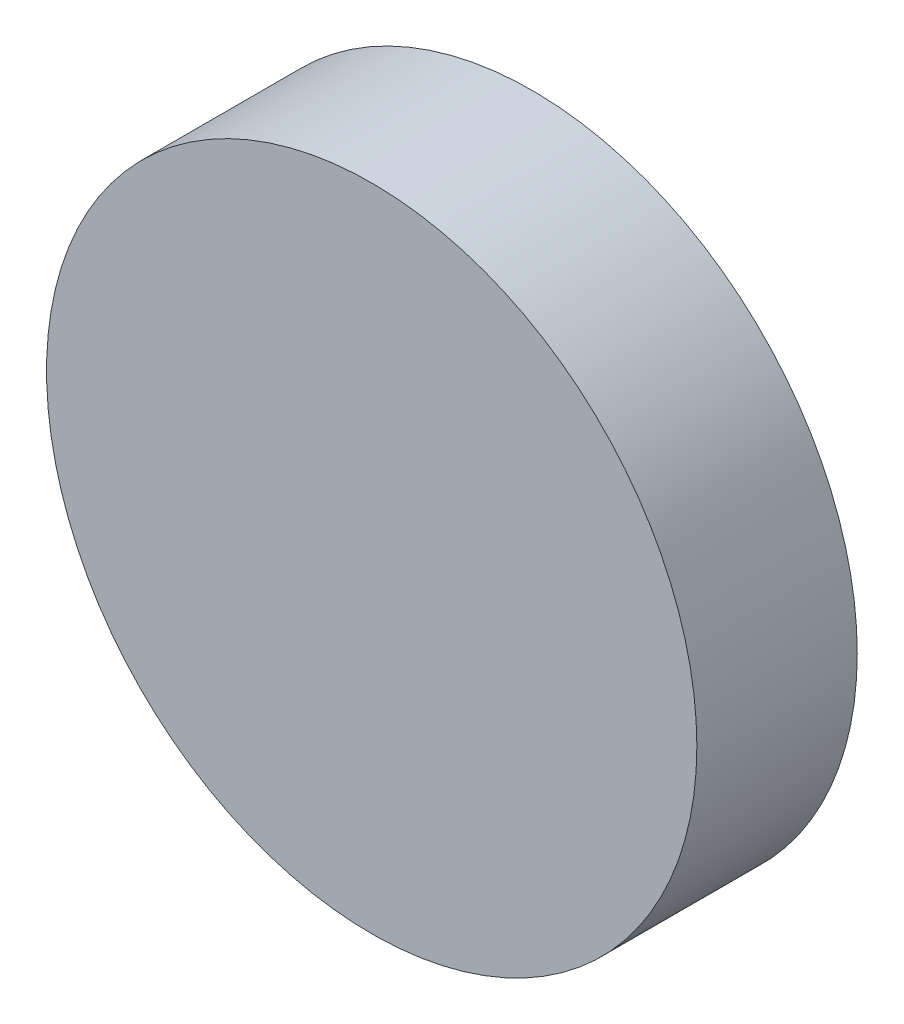
ISO-10303-21;
HEADER;
FILE_DESCRIPTION(('STEP AP214'),'2;1');
FILE_NAME('part.step','',(''),(''),'','','');
FILE_SCHEMA(('AUTOMOTIVE_DESIGN { 1 0 10303 214 1 1 1 1 }'));
ENDSEC;
DATA;
#1=APPLICATION_CONTEXT('core data for automotive mechanical design processes');
#2=APPLICATION_PROTOCOL_DEFINITION('international standard','automotive_design',2000,#1);
#3=PRODUCT_CONTEXT('',#1,'mechanical');
#4=PRODUCT('Part','Part','',(#3));
#5=PRODUCT_RELATED_PRODUCT_CATEGORY('part','',(#4));
#6=PRODUCT_DEFINITION_FORMATION('','',#4);
#7=PRODUCT_DEFINITION_CONTEXT('part definition',#1,'design');
#8=PRODUCT_DEFINITION('design','',#6,#7);
#9=PRODUCT_DEFINITION_SHAPE('','',#8);
#10=(LENGTH_UNIT() NAMED_UNIT(*) SI_UNIT(.MILLI.,.METRE.));
#11=(NAMED_UNIT(*) PLANE_ANGLE_UNIT() SI_UNIT($,.RADIAN.));
#12=(NAMED_UNIT(*) SI_UNIT($,.STERADIAN.) SOLID_ANGLE_UNIT());
#13=UNCERTAINTY_MEASURE_WITH_UNIT(LENGTH_MEASURE(1.E-05),#10,'distance_accuracy_value','');
#14=(GEOMETRIC_REPRESENTATION_CONTEXT(3) GLOBAL_UNCERTAINTY_ASSIGNED_CONTEXT((#13)) GLOBAL_UNIT_ASSIGNED_CONTEXT((#10,
#11,#12)) REPRESENTATION_CONTEXT('',''));
#15=CARTESIAN_POINT('',(0.,0.,0.));
#16=DIRECTION('',(0.,0.,1.));
#17=DIRECTION('',(1.,0.,0.));
#18=AXIS2_PLACEMENT_3D('',#15,#16,#17);
#19=CARTESIAN_POINT('',(0.,0.,0.1));
#20=DIRECTION('',(0.,0.,-1.));
#21=DIRECTION('',(-1.,0.,0.));
#22=AXIS2_PLACEMENT_3D('',#19,#20,#21);
#23=CYLINDRICAL_SURFACE('',#22,0.202712715);
#24=CARTESIAN_POINT('',(0.,0.,0.1));
#25=DIRECTION('',(0.,0.,1.));
#26=DIRECTION('',(1.,0.,0.));
#27=AXIS2_PLACEMENT_3D('',#24,#25,#26);
#28=CIRCLE('',#27,0.202712715);
#29=CARTESIAN_POINT('',(0.202712715,0.,0.1));
#30=VERTEX_POINT('',#29);
#31=EDGE_CURVE('E10',#30,#30,#28,.T.);
#32=ORIENTED_EDGE('',*,*,#31,.F.);
#33=EDGE_LOOP('',(#32));
#34=FACE_BOUND('',#33,.T.);
#35=CARTESIAN_POINT('',(0.,0.,0.));
#36=DIRECTION('',(0.,0.,1.));
#37=DIRECTION('',(1.,0.,0.));
#38=AXIS2_PLACEMENT_3D('',#35,#36,#37);
#39=CIRCLE('',#38,0.202712715);
#40=CARTESIAN_POINT('',(0.202712715,0.,0.));
#41=VERTEX_POINT('',#40);
#42=EDGE_CURVE('E34',#41,#41,#39,.T.);
#43=ORIENTED_EDGE('',*,*,#42,.T.);
#44=EDGE_LOOP('',(#43));
#45=FACE_BOUND('',#44,.T.);
#46=ADVANCED_FACE('F31',(#34,#45),#23,.T.);
#47=CARTESIAN_POINT('',(0.,0.,0.1));
#48=DIRECTION('',(0.,0.,1.));
#49=DIRECTION('',(1.,0.,0.));
#50=AXIS2_PLACEMENT_3D('',#47,#48,#49);
#51=PLANE('',#50);
#52=ORIENTED_EDGE('',*,*,#31,.T.);
#53=EDGE_LOOP('',(#52));
#54=FACE_BOUND('',#53,.T.);
#55=ADVANCED_FACE('F46',(#54),#51,.T.);
#56=CARTESIAN_POINT('',(0.,0.,0.));
#57=DIRECTION('',(0.,0.,1.));
#58=DIRECTION('',(1.,0.,0.));
#59=AXIS2_PLACEMENT_3D('',#56,#57,#58);
#60=PLANE('',#59);
#61=ORIENTED_EDGE('',*,*,#42,.F.);
#62=EDGE_LOOP('',(#61));
#63=FACE_BOUND('',#62,.T.);
#64=ADVANCED_FACE('F44',(#63),#60,.F.);
#65=CLOSED_SHELL('',(#46,#55,#64));
#66=MANIFOLD_SOLID_BREP('B2',#65);
#67=ADVANCED_BREP_SHAPE_REPRESENTATION('',(#18,#66),#14);
#68=SHAPE_DEFINITION_REPRESENTATION(#9,#67);
ENDSEC;
END-ISO-10303-21;
